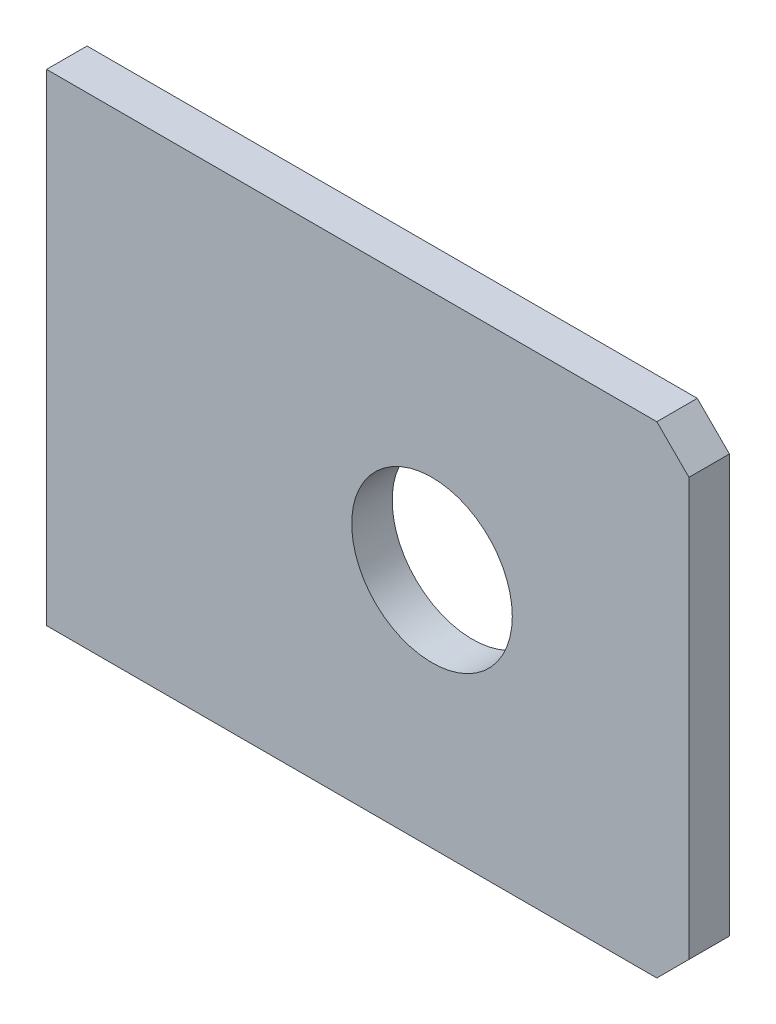
ISO-10303-21;
HEADER;
FILE_DESCRIPTION(('STEP AP214'),'2;1');
FILE_NAME('part.step','',(''),(''),'','','');
FILE_SCHEMA(('AUTOMOTIVE_DESIGN { 1 0 10303 214 1 1 1 1 }'));
ENDSEC;
DATA;
#1=APPLICATION_CONTEXT('core data for automotive mechanical design processes');
#2=APPLICATION_PROTOCOL_DEFINITION('international standard','automotive_design',2000,#1);
#3=PRODUCT_CONTEXT('',#1,'mechanical');
#4=PRODUCT('Part','Part','',(#3));
#5=PRODUCT_RELATED_PRODUCT_CATEGORY('part','',(#4));
#6=PRODUCT_DEFINITION_FORMATION('','',#4);
#7=PRODUCT_DEFINITION_CONTEXT('part definition',#1,'design');
#8=PRODUCT_DEFINITION('design','',#6,#7);
#9=PRODUCT_DEFINITION_SHAPE('','',#8);
#10=(LENGTH_UNIT() NAMED_UNIT(*) SI_UNIT(.MILLI.,.METRE.));
#11=(NAMED_UNIT(*) PLANE_ANGLE_UNIT() SI_UNIT($,.RADIAN.));
#12=(NAMED_UNIT(*) SI_UNIT($,.STERADIAN.) SOLID_ANGLE_UNIT());
#13=UNCERTAINTY_MEASURE_WITH_UNIT(LENGTH_MEASURE(1.E-05),#10,'distance_accuracy_value','');
#14=(GEOMETRIC_REPRESENTATION_CONTEXT(3) GLOBAL_UNCERTAINTY_ASSIGNED_CONTEXT((#13)) GLOBAL_UNIT_ASSIGNED_CONTEXT((#10,
#11,#12)) REPRESENTATION_CONTEXT('',''));
#15=CARTESIAN_POINT('',(0.,0.,0.));
#16=DIRECTION('',(0.,0.,1.));
#17=DIRECTION('',(1.,0.,0.));
#18=AXIS2_PLACEMENT_3D('',#15,#16,#17);
#19=CARTESIAN_POINT('',(0.,0.,1.26));
#20=DIRECTION('',(0.,0.,1.));
#21=DIRECTION('',(1.,0.,0.));
#22=AXIS2_PLACEMENT_3D('',#19,#20,#21);
#23=PLANE('',#22);
#24=DIRECTION('',(0.707106781186548,0.707106781186548,0.));
#25=VECTOR('',#24,1.);
#26=CARTESIAN_POINT('',(13.,-7.5,1.26));
#27=LINE('',#26,#25);
#28=CARTESIAN_POINT('',(13.,-7.5,1.26));
#29=VERTEX_POINT('',#28);
#30=CARTESIAN_POINT('',(14.,-6.49999999999997,1.26));
#31=VERTEX_POINT('',#30);
#32=EDGE_CURVE('E139',#29,#31,#27,.T.);
#33=ORIENTED_EDGE('',*,*,#32,.T.);
#34=DIRECTION('',(0.,1.,0.));
#35=VECTOR('',#34,1.);
#36=CARTESIAN_POINT('',(14.,-6.49999999999997,1.26));
#37=LINE('',#36,#35);
#38=CARTESIAN_POINT('',(14.,6.50000000000003,1.26));
#39=VERTEX_POINT('',#38);
#40=EDGE_CURVE('E97',#31,#39,#37,.T.);
#41=ORIENTED_EDGE('',*,*,#40,.T.);
#42=DIRECTION('',(-0.707106781186548,0.707106781186548,0.));
#43=VECTOR('',#42,1.);
#44=CARTESIAN_POINT('',(14.,6.50000000000003,1.26));
#45=LINE('',#44,#43);
#46=CARTESIAN_POINT('',(13.,7.5,1.26));
#47=VERTEX_POINT('',#46);
#48=EDGE_CURVE('E110',#39,#47,#45,.T.);
#49=ORIENTED_EDGE('',*,*,#48,.T.);
#50=DIRECTION('',(-1.,0.,0.));
#51=VECTOR('',#50,1.);
#52=CARTESIAN_POINT('',(13.,7.5,1.26));
#53=LINE('',#52,#51);
#54=CARTESIAN_POINT('',(-6.,7.5,1.26));
#55=VERTEX_POINT('',#54);
#56=EDGE_CURVE('E104',#47,#55,#53,.T.);
#57=ORIENTED_EDGE('',*,*,#56,.T.);
#58=DIRECTION('',(0.,-1.,0.));
#59=VECTOR('',#58,1.);
#60=CARTESIAN_POINT('',(-6.,7.5,1.26));
#61=LINE('',#60,#59);
#62=CARTESIAN_POINT('',(-6.,-7.5,1.26));
#63=VERTEX_POINT('',#62);
#64=EDGE_CURVE('E108',#55,#63,#61,.T.);
#65=ORIENTED_EDGE('',*,*,#64,.T.);
#66=DIRECTION('',(1.,0.,0.));
#67=VECTOR('',#66,1.);
#68=CARTESIAN_POINT('',(-6.,-7.5,1.26));
#69=LINE('',#68,#67);
#70=EDGE_CURVE('E60',#63,#29,#69,.T.);
#71=ORIENTED_EDGE('',*,*,#70,.T.);
#72=EDGE_LOOP('',(#33,#41,#49,#57,#65,#71));
#73=FACE_BOUND('',#72,.T.);
#74=CARTESIAN_POINT('',(6.,0.,1.26));
#75=DIRECTION('',(0.,0.,1.));
#76=DIRECTION('',(1.,0.,0.));
#77=AXIS2_PLACEMENT_3D('',#74,#75,#76);
#78=CIRCLE('',#77,2.5);
#79=CARTESIAN_POINT('',(8.5,0.,1.26));
#80=VERTEX_POINT('',#79);
#81=EDGE_CURVE('E132',#80,#80,#78,.T.);
#82=ORIENTED_EDGE('',*,*,#81,.F.);
#83=EDGE_LOOP('',(#82));
#84=FACE_BOUND('',#83,.T.);
#85=ADVANCED_FACE('F43',(#73,#84),#23,.T.);
#86=CARTESIAN_POINT('',(0.,0.,0.));
#87=DIRECTION('',(0.,0.,1.));
#88=DIRECTION('',(1.,0.,0.));
#89=AXIS2_PLACEMENT_3D('',#86,#87,#88);
#90=PLANE('',#89);
#91=DIRECTION('',(0.707106781186548,0.707106781186548,0.));
#92=VECTOR('',#91,1.);
#93=CARTESIAN_POINT('',(13.,-7.5,0.));
#94=LINE('',#93,#92);
#95=CARTESIAN_POINT('',(13.,-7.5,0.));
#96=VERTEX_POINT('',#95);
#97=CARTESIAN_POINT('',(14.,-6.49999999999997,0.));
#98=VERTEX_POINT('',#97);
#99=EDGE_CURVE('E128',#96,#98,#94,.T.);
#100=ORIENTED_EDGE('',*,*,#99,.F.);
#101=DIRECTION('',(1.,0.,0.));
#102=VECTOR('',#101,1.);
#103=CARTESIAN_POINT('',(-6.,-7.5,0.));
#104=LINE('',#103,#102);
#105=CARTESIAN_POINT('',(-6.,-7.5,0.));
#106=VERTEX_POINT('',#105);
#107=EDGE_CURVE('E89',#106,#96,#104,.T.);
#108=ORIENTED_EDGE('',*,*,#107,.F.);
#109=DIRECTION('',(0.,-1.,0.));
#110=VECTOR('',#109,1.);
#111=CARTESIAN_POINT('',(-6.,7.5,0.));
#112=LINE('',#111,#110);
#113=CARTESIAN_POINT('',(-6.,7.5,0.));
#114=VERTEX_POINT('',#113);
#115=EDGE_CURVE('E83',#114,#106,#112,.T.);
#116=ORIENTED_EDGE('',*,*,#115,.F.);
#117=DIRECTION('',(-1.,0.,0.));
#118=VECTOR('',#117,1.);
#119=CARTESIAN_POINT('',(13.,7.5,0.));
#120=LINE('',#119,#118);
#121=CARTESIAN_POINT('',(13.,7.5,0.));
#122=VERTEX_POINT('',#121);
#123=EDGE_CURVE('E118',#122,#114,#120,.T.);
#124=ORIENTED_EDGE('',*,*,#123,.F.);
#125=DIRECTION('',(-0.707106781186548,0.707106781186548,0.));
#126=VECTOR('',#125,1.);
#127=CARTESIAN_POINT('',(14.,6.50000000000003,0.));
#128=LINE('',#127,#126);
#129=CARTESIAN_POINT('',(14.,6.50000000000003,0.));
#130=VERTEX_POINT('',#129);
#131=EDGE_CURVE('E134',#130,#122,#128,.T.);
#132=ORIENTED_EDGE('',*,*,#131,.F.);
#133=DIRECTION('',(0.,1.,0.));
#134=VECTOR('',#133,1.);
#135=CARTESIAN_POINT('',(14.,-6.49999999999997,0.));
#136=LINE('',#135,#134);
#137=EDGE_CURVE('E131',#98,#130,#136,.T.);
#138=ORIENTED_EDGE('',*,*,#137,.F.);
#139=EDGE_LOOP('',(#100,#108,#116,#124,#132,#138));
#140=FACE_BOUND('',#139,.T.);
#141=CARTESIAN_POINT('',(6.,0.,0.));
#142=DIRECTION('',(0.,0.,1.));
#143=DIRECTION('',(1.,0.,0.));
#144=AXIS2_PLACEMENT_3D('',#141,#142,#143);
#145=CIRCLE('',#144,2.5);
#146=CARTESIAN_POINT('',(8.5,0.,0.));
#147=VERTEX_POINT('',#146);
#148=EDGE_CURVE('E268',#147,#147,#145,.T.);
#149=ORIENTED_EDGE('',*,*,#148,.T.);
#150=EDGE_LOOP('',(#149));
#151=FACE_BOUND('',#150,.T.);
#152=ADVANCED_FACE('F148',(#140,#151),#90,.F.);
#153=CARTESIAN_POINT('',(13.,-7.5,1.26));
#154=DIRECTION('',(-0.707106781186547,0.707106781186547,0.));
#155=DIRECTION('',(-0.707106781186548,-0.707106781186548,0.));
#156=AXIS2_PLACEMENT_3D('',#153,#154,#155);
#157=PLANE('',#156);
#158=ORIENTED_EDGE('',*,*,#99,.T.);
#159=DIRECTION('',(0.,0.,-1.));
#160=VECTOR('',#159,1.);
#161=CARTESIAN_POINT('',(14.,-6.49999999999997,1.26));
#162=LINE('',#161,#160);
#163=EDGE_CURVE('E11',#31,#98,#162,.T.);
#164=ORIENTED_EDGE('',*,*,#163,.F.);
#165=ORIENTED_EDGE('',*,*,#32,.F.);
#166=DIRECTION('',(0.,0.,-1.));
#167=VECTOR('',#166,1.);
#168=CARTESIAN_POINT('',(13.,-7.5,1.26));
#169=LINE('',#168,#167);
#170=EDGE_CURVE('E124',#29,#96,#169,.T.);
#171=ORIENTED_EDGE('',*,*,#170,.T.);
#172=EDGE_LOOP('',(#158,#164,#165,#171));
#173=FACE_BOUND('',#172,.T.);
#174=ADVANCED_FACE('F45',(#173),#157,.F.);
#175=CARTESIAN_POINT('',(14.,-6.49999999999997,1.26));
#176=DIRECTION('',(-1.,0.,0.));
#177=DIRECTION('',(0.,0.,1.));
#178=AXIS2_PLACEMENT_3D('',#175,#176,#177);
#179=PLANE('',#178);
#180=ORIENTED_EDGE('',*,*,#137,.T.);
#181=DIRECTION('',(0.,0.,-1.));
#182=VECTOR('',#181,1.);
#183=CARTESIAN_POINT('',(14.,6.50000000000003,1.26));
#184=LINE('',#183,#182);
#185=EDGE_CURVE('E52',#39,#130,#184,.T.);
#186=ORIENTED_EDGE('',*,*,#185,.F.);
#187=ORIENTED_EDGE('',*,*,#40,.F.);
#188=ORIENTED_EDGE('',*,*,#163,.T.);
#189=EDGE_LOOP('',(#180,#186,#187,#188));
#190=FACE_BOUND('',#189,.T.);
#191=ADVANCED_FACE('F173',(#190),#179,.F.);
#192=CARTESIAN_POINT('',(14.,6.50000000000003,1.26));
#193=DIRECTION('',(-0.707106781186547,-0.707106781186547,0.));
#194=DIRECTION('',(0.707106781186548,-0.707106781186548,0.));
#195=AXIS2_PLACEMENT_3D('',#192,#193,#194);
#196=PLANE('',#195);
#197=ORIENTED_EDGE('',*,*,#131,.T.);
#198=DIRECTION('',(0.,0.,-1.));
#199=VECTOR('',#198,1.);
#200=CARTESIAN_POINT('',(13.,7.5,1.26));
#201=LINE('',#200,#199);
#202=EDGE_CURVE('E119',#47,#122,#201,.T.);
#203=ORIENTED_EDGE('',*,*,#202,.F.);
#204=ORIENTED_EDGE('',*,*,#48,.F.);
#205=ORIENTED_EDGE('',*,*,#185,.T.);
#206=EDGE_LOOP('',(#197,#203,#204,#205));
#207=FACE_BOUND('',#206,.T.);
#208=ADVANCED_FACE('F145',(#207),#196,.F.);
#209=CARTESIAN_POINT('',(13.,7.5,1.26));
#210=DIRECTION('',(0.,-1.,0.));
#211=DIRECTION('',(0.,0.,-1.));
#212=AXIS2_PLACEMENT_3D('',#209,#210,#211);
#213=PLANE('',#212);
#214=ORIENTED_EDGE('',*,*,#123,.T.);
#215=DIRECTION('',(0.,0.,-1.));
#216=VECTOR('',#215,1.);
#217=CARTESIAN_POINT('',(-6.,7.5,1.26));
#218=LINE('',#217,#216);
#219=EDGE_CURVE('E115',#55,#114,#218,.T.);
#220=ORIENTED_EDGE('',*,*,#219,.F.);
#221=ORIENTED_EDGE('',*,*,#56,.F.);
#222=ORIENTED_EDGE('',*,*,#202,.T.);
#223=EDGE_LOOP('',(#214,#220,#221,#222));
#224=FACE_BOUND('',#223,.T.);
#225=ADVANCED_FACE('F116',(#224),#213,.F.);
#226=CARTESIAN_POINT('',(-6.,7.5,1.26));
#227=DIRECTION('',(1.,0.,0.));
#228=DIRECTION('',(0.,0.,-1.));
#229=AXIS2_PLACEMENT_3D('',#226,#227,#228);
#230=PLANE('',#229);
#231=ORIENTED_EDGE('',*,*,#115,.T.);
#232=DIRECTION('',(0.,0.,-1.));
#233=VECTOR('',#232,1.);
#234=CARTESIAN_POINT('',(-6.,-7.5,1.26));
#235=LINE('',#234,#233);
#236=EDGE_CURVE('E120',#63,#106,#235,.T.);
#237=ORIENTED_EDGE('',*,*,#236,.F.);
#238=ORIENTED_EDGE('',*,*,#64,.F.);
#239=ORIENTED_EDGE('',*,*,#219,.T.);
#240=EDGE_LOOP('',(#231,#237,#238,#239));
#241=FACE_BOUND('',#240,.T.);
#242=ADVANCED_FACE('F122',(#241),#230,.F.);
#243=CARTESIAN_POINT('',(-6.,-7.5,1.26));
#244=DIRECTION('',(0.,1.,0.));
#245=DIRECTION('',(0.,0.,1.));
#246=AXIS2_PLACEMENT_3D('',#243,#244,#245);
#247=PLANE('',#246);
#248=ORIENTED_EDGE('',*,*,#107,.T.);
#249=ORIENTED_EDGE('',*,*,#170,.F.);
#250=ORIENTED_EDGE('',*,*,#70,.F.);
#251=ORIENTED_EDGE('',*,*,#236,.T.);
#252=EDGE_LOOP('',(#248,#249,#250,#251));
#253=FACE_BOUND('',#252,.T.);
#254=ADVANCED_FACE('F153',(#253),#247,.F.);
#255=CARTESIAN_POINT('',(6.,0.,1.26));
#256=DIRECTION('',(0.,0.,-1.));
#257=DIRECTION('',(-1.,0.,0.));
#258=AXIS2_PLACEMENT_3D('',#255,#256,#257);
#259=CYLINDRICAL_SURFACE('',#258,2.5);
#260=ORIENTED_EDGE('',*,*,#81,.T.);
#261=EDGE_LOOP('',(#260));
#262=FACE_BOUND('',#261,.T.);
#263=ORIENTED_EDGE('',*,*,#148,.F.);
#264=EDGE_LOOP('',(#263));
#265=FACE_BOUND('',#264,.T.);
#266=ADVANCED_FACE('F155',(#262,#265),#259,.F.);
#267=CLOSED_SHELL('',(#85,#152,#174,#191,#208,#225,#242,#254,#266));
#268=MANIFOLD_SOLID_BREP('B2',#267);
#269=ADVANCED_BREP_SHAPE_REPRESENTATION('',(#18,#268),#14);
#270=SHAPE_DEFINITION_REPRESENTATION(#9,#269);
ENDSEC;
END-ISO-10303-21;
